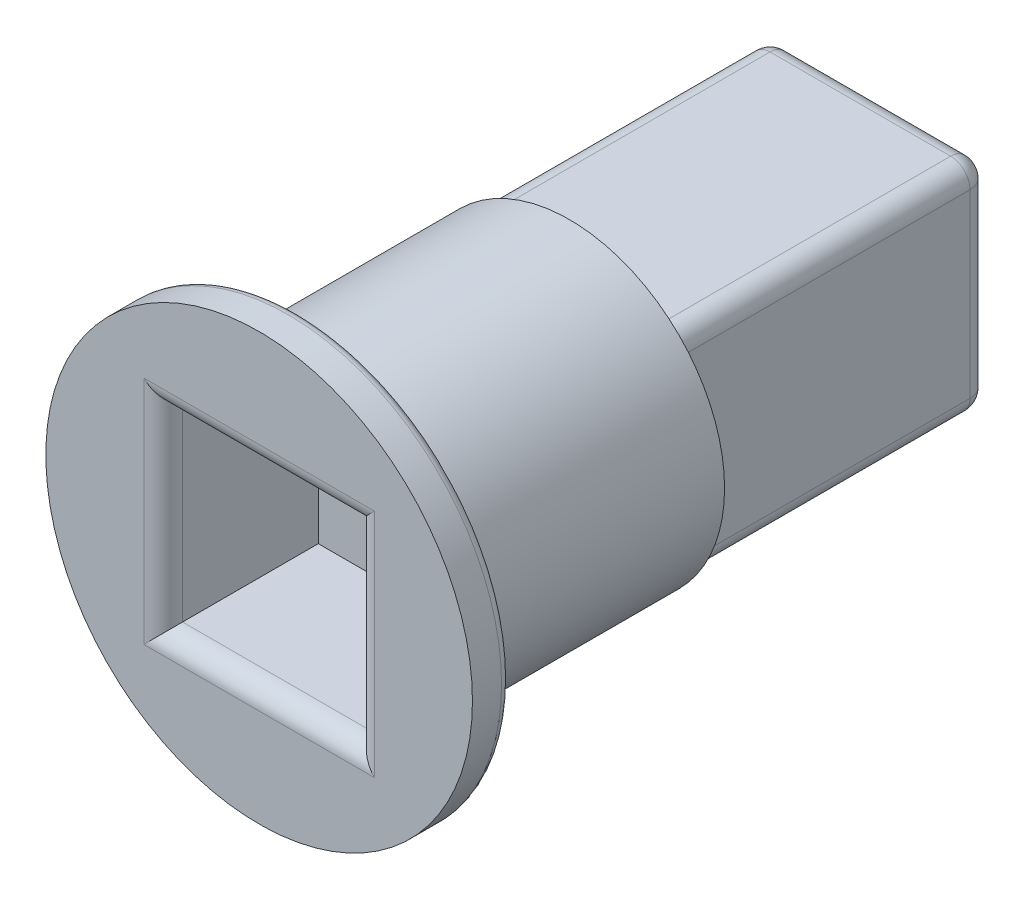
ISO-10303-21;
HEADER;
FILE_DESCRIPTION(('STEP AP214'),'2;1');
FILE_NAME('part.step','',(''),(''),'','','');
FILE_SCHEMA(('AUTOMOTIVE_DESIGN { 1 0 10303 214 1 1 1 1 }'));
ENDSEC;
DATA;
#1=APPLICATION_CONTEXT('core data for automotive mechanical design processes');
#2=APPLICATION_PROTOCOL_DEFINITION('international standard','automotive_design',2000,#1);
#3=PRODUCT_CONTEXT('',#1,'mechanical');
#4=PRODUCT('Part','Part','',(#3));
#5=PRODUCT_RELATED_PRODUCT_CATEGORY('part','',(#4));
#6=PRODUCT_DEFINITION_FORMATION('','',#4);
#7=PRODUCT_DEFINITION_CONTEXT('part definition',#1,'design');
#8=PRODUCT_DEFINITION('design','',#6,#7);
#9=PRODUCT_DEFINITION_SHAPE('','',#8);
#10=(LENGTH_UNIT() NAMED_UNIT(*) SI_UNIT(.MILLI.,.METRE.));
#11=(NAMED_UNIT(*) PLANE_ANGLE_UNIT() SI_UNIT($,.RADIAN.));
#12=(NAMED_UNIT(*) SI_UNIT($,.STERADIAN.) SOLID_ANGLE_UNIT());
#13=UNCERTAINTY_MEASURE_WITH_UNIT(LENGTH_MEASURE(1.E-05),#10,'distance_accuracy_value','');
#14=(GEOMETRIC_REPRESENTATION_CONTEXT(3) GLOBAL_UNCERTAINTY_ASSIGNED_CONTEXT((#13)) GLOBAL_UNIT_ASSIGNED_CONTEXT((#10,
#11,#12)) REPRESENTATION_CONTEXT('',''));
#15=CARTESIAN_POINT('',(0.,0.,0.));
#16=DIRECTION('',(0.,0.,1.));
#17=DIRECTION('',(1.,0.,0.));
#18=AXIS2_PLACEMENT_3D('',#15,#16,#17);
#19=CARTESIAN_POINT('',(0.,0.,-15.));
#20=DIRECTION('',(0.,0.,1.));
#21=DIRECTION('',(1.,0.,0.));
#22=AXIS2_PLACEMENT_3D('',#19,#20,#21);
#23=CYLINDRICAL_SURFACE('',#22,1.5);
#24=CARTESIAN_POINT('',(0.,0.,-15.));
#25=DIRECTION('',(0.,0.,1.));
#26=DIRECTION('',(1.,0.,0.));
#27=AXIS2_PLACEMENT_3D('',#24,#25,#26);
#28=CIRCLE('',#27,1.5);
#29=CARTESIAN_POINT('',(1.5,0.,-15.));
#30=VERTEX_POINT('',#29);
#31=EDGE_CURVE('E191',#30,#30,#28,.T.);
#32=ORIENTED_EDGE('',*,*,#31,.F.);
#33=EDGE_LOOP('',(#32));
#34=FACE_BOUND('',#33,.T.);
#35=CARTESIAN_POINT('',(0.,0.,-3.));
#36=DIRECTION('',(0.,0.,1.));
#37=DIRECTION('',(1.,0.,0.));
#38=AXIS2_PLACEMENT_3D('',#35,#36,#37);
#39=CIRCLE('',#38,1.5);
#40=CARTESIAN_POINT('',(1.5,0.,-3.));
#41=VERTEX_POINT('',#40);
#42=EDGE_CURVE('E187',#41,#41,#39,.F.);
#43=ORIENTED_EDGE('',*,*,#42,.F.);
#44=EDGE_LOOP('',(#43));
#45=FACE_BOUND('',#44,.T.);
#46=ADVANCED_FACE('F30',(#34,#45),#23,.F.);
#47=CARTESIAN_POINT('',(0.,0.,-7.));
#48=DIRECTION('',(0.,0.,1.));
#49=DIRECTION('',(1.,0.,0.));
#50=AXIS2_PLACEMENT_3D('',#47,#48,#49);
#51=PLANE('',#50);
#52=CARTESIAN_POINT('',(0.,0.,-7.));
#53=DIRECTION('',(0.,0.,1.));
#54=DIRECTION('',(1.,0.,0.));
#55=AXIS2_PLACEMENT_3D('',#52,#53,#54);
#56=CIRCLE('',#55,4.);
#57=CARTESIAN_POINT('',(2.82842712474619,2.82842712474619,-7.));
#58=VERTEX_POINT('',#57);
#59=CARTESIAN_POINT('',(-2.82842712474619,2.82842712474619,-7.));
#60=VERTEX_POINT('',#59);
#61=EDGE_CURVE('E208',#58,#60,#56,.T.);
#62=ORIENTED_EDGE('',*,*,#61,.F.);
#63=CARTESIAN_POINT('',(2.82842712474619,-2.82842712474619,-7.));
#64=VERTEX_POINT('',#63);
#65=EDGE_CURVE('E213',#64,#58,#56,.T.);
#66=ORIENTED_EDGE('',*,*,#65,.F.);
#67=CARTESIAN_POINT('',(-2.82842712474619,-2.82842712474619,-7.));
#68=VERTEX_POINT('',#67);
#69=EDGE_CURVE('E697',#68,#64,#56,.T.);
#70=ORIENTED_EDGE('',*,*,#69,.F.);
#71=EDGE_CURVE('E212',#60,#68,#56,.T.);
#72=ORIENTED_EDGE('',*,*,#71,.F.);
#73=EDGE_LOOP('',(#62,#66,#70,#72));
#74=FACE_BOUND('',#73,.T.);
#75=DIRECTION('',(1.,0.,0.));
#76=VECTOR('',#75,1.);
#77=CARTESIAN_POINT('',(2.82842712474619,2.82842712474619,-7.));
#78=LINE('',#77,#76);
#79=CARTESIAN_POINT('',(-2.32842712474619,2.82842712474619,-7.));
#80=VERTEX_POINT('',#79);
#81=CARTESIAN_POINT('',(2.32842712474619,2.82842712474619,-7.));
#82=VERTEX_POINT('',#81);
#83=EDGE_CURVE('E205',#80,#82,#78,.T.);
#84=ORIENTED_EDGE('',*,*,#83,.F.);
#85=CARTESIAN_POINT('',(-2.32842712474619,2.32842712474619,-7.));
#86=DIRECTION('',(0.,0.,1.));
#87=DIRECTION('',(1.,0.,0.));
#88=AXIS2_PLACEMENT_3D('',#85,#86,#87);
#89=CIRCLE('',#88,0.5);
#90=CARTESIAN_POINT('',(-2.82842712474619,2.32842712474619,-7.));
#91=VERTEX_POINT('',#90);
#92=EDGE_CURVE('E255',#80,#91,#89,.T.);
#93=ORIENTED_EDGE('',*,*,#92,.T.);
#94=DIRECTION('',(0.,1.,0.));
#95=VECTOR('',#94,1.);
#96=CARTESIAN_POINT('',(-2.82842712474619,2.82842712474619,-7.));
#97=LINE('',#96,#95);
#98=CARTESIAN_POINT('',(-2.82842712474619,-2.32842712474619,-7.));
#99=VERTEX_POINT('',#98);
#100=EDGE_CURVE('E203',#99,#91,#97,.T.);
#101=ORIENTED_EDGE('',*,*,#100,.F.);
#102=CARTESIAN_POINT('',(-2.32842712474619,-2.32842712474619,-7.));
#103=DIRECTION('',(0.,0.,1.));
#104=DIRECTION('',(1.,0.,0.));
#105=AXIS2_PLACEMENT_3D('',#102,#103,#104);
#106=CIRCLE('',#105,0.5);
#107=CARTESIAN_POINT('',(-2.32842712474619,-2.82842712474619,-7.));
#108=VERTEX_POINT('',#107);
#109=EDGE_CURVE('E249',#99,#108,#106,.T.);
#110=ORIENTED_EDGE('',*,*,#109,.T.);
#111=DIRECTION('',(-1.,0.,0.));
#112=VECTOR('',#111,1.);
#113=CARTESIAN_POINT('',(2.82842712474619,-2.82842712474619,-7.));
#114=LINE('',#113,#112);
#115=CARTESIAN_POINT('',(2.32842712474619,-2.82842712474619,-7.));
#116=VERTEX_POINT('',#115);
#117=EDGE_CURVE('E200',#116,#108,#114,.T.);
#118=ORIENTED_EDGE('',*,*,#117,.F.);
#119=CARTESIAN_POINT('',(2.32842712474619,-2.32842712474619,-7.));
#120=DIRECTION('',(0.,0.,1.));
#121=DIRECTION('',(1.,0.,0.));
#122=AXIS2_PLACEMENT_3D('',#119,#120,#121);
#123=CIRCLE('',#122,0.5);
#124=CARTESIAN_POINT('',(2.82842712474619,-2.32842712474619,-7.));
#125=VERTEX_POINT('',#124);
#126=EDGE_CURVE('E252',#116,#125,#123,.T.);
#127=ORIENTED_EDGE('',*,*,#126,.T.);
#128=DIRECTION('',(0.,-1.,0.));
#129=VECTOR('',#128,1.);
#130=CARTESIAN_POINT('',(2.82842712474619,2.82842712474619,-7.));
#131=LINE('',#130,#129);
#132=CARTESIAN_POINT('',(2.82842712474619,2.32842712474619,-7.));
#133=VERTEX_POINT('',#132);
#134=EDGE_CURVE('E198',#133,#125,#131,.T.);
#135=ORIENTED_EDGE('',*,*,#134,.F.);
#136=CARTESIAN_POINT('',(2.32842712474619,2.32842712474619,-7.));
#137=DIRECTION('',(0.,0.,1.));
#138=DIRECTION('',(1.,0.,0.));
#139=AXIS2_PLACEMENT_3D('',#136,#137,#138);
#140=CIRCLE('',#139,0.5);
#141=EDGE_CURVE('E258',#133,#82,#140,.T.);
#142=ORIENTED_EDGE('',*,*,#141,.T.);
#143=EDGE_LOOP('',(#84,#93,#101,#110,#118,#127,#135,#142));
#144=FACE_BOUND('',#143,.T.);
#145=ADVANCED_FACE('F344',(#74,#144),#51,.F.);
#146=CARTESIAN_POINT('',(0.,0.,-7.));
#147=DIRECTION('',(0.,0.,1.));
#148=DIRECTION('',(1.,0.,0.));
#149=AXIS2_PLACEMENT_3D('',#146,#147,#148);
#150=CYLINDRICAL_SURFACE('',#149,4.);
#151=ORIENTED_EDGE('',*,*,#61,.T.);
#152=ORIENTED_EDGE('',*,*,#71,.T.);
#153=ORIENTED_EDGE('',*,*,#69,.T.);
#154=ORIENTED_EDGE('',*,*,#65,.T.);
#155=EDGE_LOOP('',(#151,#152,#153,#154));
#156=FACE_BOUND('',#155,.T.);
#157=CARTESIAN_POINT('',(0.,0.,0.));
#158=DIRECTION('',(0.,0.,1.));
#159=DIRECTION('',(1.,0.,0.));
#160=AXIS2_PLACEMENT_3D('',#157,#158,#159);
#161=CIRCLE('',#160,4.);
#162=CARTESIAN_POINT('',(4.,0.,0.));
#163=VERTEX_POINT('',#162);
#164=EDGE_CURVE('E207',#163,#163,#161,.T.);
#165=ORIENTED_EDGE('',*,*,#164,.F.);
#166=EDGE_LOOP('',(#165));
#167=FACE_BOUND('',#166,.T.);
#168=ADVANCED_FACE('F350',(#156,#167),#150,.T.);
#169=CARTESIAN_POINT('',(2.82842712474619,2.82842712474619,-15.));
#170=DIRECTION('',(-1.,0.,0.));
#171=DIRECTION('',(0.,0.,1.));
#172=AXIS2_PLACEMENT_3D('',#169,#170,#171);
#173=PLANE('',#172);
#174=ORIENTED_EDGE('',*,*,#134,.T.);
#175=DIRECTION('',(0.,0.,1.));
#176=VECTOR('',#175,1.);
#177=CARTESIAN_POINT('',(2.82842712474619,-2.32842712474619,-15.));
#178=LINE('',#177,#176);
#179=CARTESIAN_POINT('',(2.82842712474619,-2.32842712474619,-14.5));
#180=VERTEX_POINT('',#179);
#181=EDGE_CURVE('E232',#125,#180,#178,.F.);
#182=ORIENTED_EDGE('',*,*,#181,.T.);
#183=DIRECTION('',(0.,-1.,0.));
#184=VECTOR('',#183,1.);
#185=CARTESIAN_POINT('',(2.82842712474619,2.82842712474619,-14.5));
#186=LINE('',#185,#184);
#187=CARTESIAN_POINT('',(2.82842712474619,2.32842712474619,-14.5));
#188=VERTEX_POINT('',#187);
#189=EDGE_CURVE('E228',#180,#188,#186,.F.);
#190=ORIENTED_EDGE('',*,*,#189,.T.);
#191=DIRECTION('',(0.,0.,1.));
#192=VECTOR('',#191,1.);
#193=CARTESIAN_POINT('',(2.82842712474619,2.32842712474619,-15.));
#194=LINE('',#193,#192);
#195=EDGE_CURVE('E230',#188,#133,#194,.T.);
#196=ORIENTED_EDGE('',*,*,#195,.T.);
#197=EDGE_LOOP('',(#174,#182,#190,#196));
#198=FACE_BOUND('',#197,.T.);
#199=ADVANCED_FACE('F386',(#198),#173,.F.);
#200=CARTESIAN_POINT('',(2.82842712474619,-2.82842712474619,-15.));
#201=DIRECTION('',(0.,1.,0.));
#202=DIRECTION('',(-1.,0.,0.));
#203=AXIS2_PLACEMENT_3D('',#200,#201,#202);
#204=PLANE('',#203);
#205=ORIENTED_EDGE('',*,*,#117,.T.);
#206=DIRECTION('',(0.,0.,1.));
#207=VECTOR('',#206,1.);
#208=CARTESIAN_POINT('',(-2.32842712474619,-2.82842712474619,-15.));
#209=LINE('',#208,#207);
#210=CARTESIAN_POINT('',(-2.32842712474619,-2.82842712474619,-14.5));
#211=VERTEX_POINT('',#210);
#212=EDGE_CURVE('E226',#108,#211,#209,.F.);
#213=ORIENTED_EDGE('',*,*,#212,.T.);
#214=DIRECTION('',(-1.,0.,0.));
#215=VECTOR('',#214,1.);
#216=CARTESIAN_POINT('',(2.82842712474619,-2.82842712474619,-14.5));
#217=LINE('',#216,#215);
#218=CARTESIAN_POINT('',(2.32842712474619,-2.82842712474619,-14.5));
#219=VERTEX_POINT('',#218);
#220=EDGE_CURVE('E222',#211,#219,#217,.F.);
#221=ORIENTED_EDGE('',*,*,#220,.T.);
#222=DIRECTION('',(0.,0.,1.));
#223=VECTOR('',#222,1.);
#224=CARTESIAN_POINT('',(2.32842712474619,-2.82842712474619,-15.));
#225=LINE('',#224,#223);
#226=EDGE_CURVE('E224',#219,#116,#225,.T.);
#227=ORIENTED_EDGE('',*,*,#226,.T.);
#228=EDGE_LOOP('',(#205,#213,#221,#227));
#229=FACE_BOUND('',#228,.T.);
#230=ADVANCED_FACE('F382',(#229),#204,.F.);
#231=CARTESIAN_POINT('',(-2.82842712474619,2.82842712474619,-15.));
#232=DIRECTION('',(1.,0.,0.));
#233=DIRECTION('',(0.,1.,0.));
#234=AXIS2_PLACEMENT_3D('',#231,#232,#233);
#235=PLANE('',#234);
#236=DIRECTION('',(0.,1.,0.));
#237=VECTOR('',#236,1.);
#238=CARTESIAN_POINT('',(-2.82842712474619,-2.82842712474619,-14.5));
#239=LINE('',#238,#237);
#240=CARTESIAN_POINT('',(-2.82842712474619,2.32842712474619,-14.5));
#241=VERTEX_POINT('',#240);
#242=CARTESIAN_POINT('',(-2.82842712474619,-2.32842712474619,-14.5));
#243=VERTEX_POINT('',#242);
#244=EDGE_CURVE('E211',#241,#243,#239,.F.);
#245=ORIENTED_EDGE('',*,*,#244,.T.);
#246=DIRECTION('',(0.,0.,1.));
#247=VECTOR('',#246,1.);
#248=CARTESIAN_POINT('',(-2.82842712474619,-2.32842712474619,-15.));
#249=LINE('',#248,#247);
#250=EDGE_CURVE('E219',#243,#99,#249,.T.);
#251=ORIENTED_EDGE('',*,*,#250,.T.);
#252=ORIENTED_EDGE('',*,*,#100,.T.);
#253=DIRECTION('',(0.,0.,1.));
#254=VECTOR('',#253,1.);
#255=CARTESIAN_POINT('',(-2.82842712474619,2.32842712474619,-15.));
#256=LINE('',#255,#254);
#257=EDGE_CURVE('E217',#91,#241,#256,.F.);
#258=ORIENTED_EDGE('',*,*,#257,.T.);
#259=EDGE_LOOP('',(#245,#251,#252,#258));
#260=FACE_BOUND('',#259,.T.);
#261=ADVANCED_FACE('F378',(#260),#235,.F.);
#262=CARTESIAN_POINT('',(2.82842712474619,2.82842712474619,-15.));
#263=DIRECTION('',(0.,-1.,0.));
#264=DIRECTION('',(1.,0.,0.));
#265=AXIS2_PLACEMENT_3D('',#262,#263,#264);
#266=PLANE('',#265);
#267=DIRECTION('',(1.,0.,0.));
#268=VECTOR('',#267,1.);
#269=CARTESIAN_POINT('',(-2.82842712474619,2.82842712474619,-14.5));
#270=LINE('',#269,#268);
#271=CARTESIAN_POINT('',(2.32842712474619,2.82842712474619,-14.5));
#272=VERTEX_POINT('',#271);
#273=CARTESIAN_POINT('',(-2.32842712474619,2.82842712474619,-14.5));
#274=VERTEX_POINT('',#273);
#275=EDGE_CURVE('E234',#272,#274,#270,.F.);
#276=ORIENTED_EDGE('',*,*,#275,.T.);
#277=DIRECTION('',(0.,0.,1.));
#278=VECTOR('',#277,1.);
#279=CARTESIAN_POINT('',(-2.32842712474619,2.82842712474619,-15.));
#280=LINE('',#279,#278);
#281=EDGE_CURVE('E238',#274,#80,#280,.T.);
#282=ORIENTED_EDGE('',*,*,#281,.T.);
#283=ORIENTED_EDGE('',*,*,#83,.T.);
#284=DIRECTION('',(0.,0.,1.));
#285=VECTOR('',#284,1.);
#286=CARTESIAN_POINT('',(2.32842712474619,2.82842712474619,-15.));
#287=LINE('',#286,#285);
#288=EDGE_CURVE('E236',#82,#272,#287,.F.);
#289=ORIENTED_EDGE('',*,*,#288,.T.);
#290=EDGE_LOOP('',(#276,#282,#283,#289));
#291=FACE_BOUND('',#290,.T.);
#292=ADVANCED_FACE('F374',(#291),#266,.F.);
#293=CARTESIAN_POINT('',(2.82842712474619,-2.82842712474619,-15.));
#294=DIRECTION('',(0.,0.,-1.));
#295=DIRECTION('',(-1.,0.,0.));
#296=AXIS2_PLACEMENT_3D('',#293,#294,#295);
#297=PLANE('',#296);
#298=ORIENTED_EDGE('',*,*,#31,.T.);
#299=EDGE_LOOP('',(#298));
#300=FACE_BOUND('',#299,.T.);
#301=DIRECTION('',(0.,-1.,0.));
#302=VECTOR('',#301,1.);
#303=CARTESIAN_POINT('',(2.32842712474619,-2.82842712474619,-15.));
#304=LINE('',#303,#302);
#305=CARTESIAN_POINT('',(2.32842712474619,2.32842712474619,-15.));
#306=VERTEX_POINT('',#305);
#307=CARTESIAN_POINT('',(2.32842712474619,-2.32842712474619,-15.));
#308=VERTEX_POINT('',#307);
#309=EDGE_CURVE('E240',#306,#308,#304,.T.);
#310=ORIENTED_EDGE('',*,*,#309,.T.);
#311=DIRECTION('',(-1.,0.,0.));
#312=VECTOR('',#311,1.);
#313=CARTESIAN_POINT('',(-2.82842712474619,-2.32842712474619,-15.));
#314=LINE('',#313,#312);
#315=CARTESIAN_POINT('',(-2.32842712474619,-2.32842712474619,-15.));
#316=VERTEX_POINT('',#315);
#317=EDGE_CURVE('E246',#308,#316,#314,.T.);
#318=ORIENTED_EDGE('',*,*,#317,.T.);
#319=DIRECTION('',(0.,1.,0.));
#320=VECTOR('',#319,1.);
#321=CARTESIAN_POINT('',(-2.32842712474619,2.82842712474619,-15.));
#322=LINE('',#321,#320);
#323=CARTESIAN_POINT('',(-2.32842712474619,2.32842712474619,-15.));
#324=VERTEX_POINT('',#323);
#325=EDGE_CURVE('E244',#316,#324,#322,.T.);
#326=ORIENTED_EDGE('',*,*,#325,.T.);
#327=DIRECTION('',(1.,0.,0.));
#328=VECTOR('',#327,1.);
#329=CARTESIAN_POINT('',(2.82842712474619,2.32842712474619,-15.));
#330=LINE('',#329,#328);
#331=EDGE_CURVE('E242',#324,#306,#330,.T.);
#332=ORIENTED_EDGE('',*,*,#331,.T.);
#333=EDGE_LOOP('',(#310,#318,#326,#332));
#334=FACE_BOUND('',#333,.T.);
#335=ADVANCED_FACE('F370',(#300,#334),#297,.T.);
#336=CARTESIAN_POINT('',(2.32842712474619,2.32842712474619,-15.));
#337=DIRECTION('',(0.,0.,1.));
#338=DIRECTION('',(1.,0.,0.));
#339=AXIS2_PLACEMENT_3D('',#336,#337,#338);
#340=CYLINDRICAL_SURFACE('',#339,0.5);
#341=CARTESIAN_POINT('',(2.32842712474619,2.32842712474619,-14.5));
#342=DIRECTION('',(0.,0.,-1.));
#343=DIRECTION('',(-1.,0.,0.));
#344=AXIS2_PLACEMENT_3D('',#341,#342,#343);
#345=CIRCLE('',#344,0.5);
#346=EDGE_CURVE('E201',#272,#188,#345,.T.);
#347=ORIENTED_EDGE('',*,*,#346,.F.);
#348=ORIENTED_EDGE('',*,*,#288,.F.);
#349=ORIENTED_EDGE('',*,*,#141,.F.);
#350=ORIENTED_EDGE('',*,*,#195,.F.);
#351=EDGE_LOOP('',(#347,#348,#349,#350));
#352=FACE_BOUND('',#351,.T.);
#353=ADVANCED_FACE('F373',(#352),#340,.T.);
#354=CARTESIAN_POINT('',(2.32842712474619,2.32842712474619,-14.5));
#355=DIRECTION('',(0.,0.,1.));
#356=DIRECTION('',(1.,0.,0.));
#357=AXIS2_PLACEMENT_3D('',#354,#355,#356);
#358=SPHERICAL_SURFACE('',#357,0.5);
#359=CARTESIAN_POINT('',(2.32842712474619,2.32842712474619,-14.5));
#360=DIRECTION('',(1.,0.,0.));
#361=DIRECTION('',(0.,0.,-1.));
#362=AXIS2_PLACEMENT_3D('',#359,#360,#361);
#363=CIRCLE('',#362,0.5);
#364=EDGE_CURVE('E287',#272,#306,#363,.F.);
#365=ORIENTED_EDGE('',*,*,#364,.F.);
#366=ORIENTED_EDGE('',*,*,#346,.T.);
#367=CARTESIAN_POINT('',(2.32842712474619,2.32842712474619,-14.5));
#368=DIRECTION('',(0.,1.,0.));
#369=DIRECTION('',(0.,0.,1.));
#370=AXIS2_PLACEMENT_3D('',#367,#368,#369);
#371=CIRCLE('',#370,0.5);
#372=EDGE_CURVE('E290',#306,#188,#371,.F.);
#373=ORIENTED_EDGE('',*,*,#372,.F.);
#374=EDGE_LOOP('',(#365,#366,#373));
#375=FACE_BOUND('',#374,.T.);
#376=ADVANCED_FACE('F432',(#375),#358,.T.);
#377=CARTESIAN_POINT('',(2.32842712474619,-2.32842712474619,-15.));
#378=DIRECTION('',(0.,0.,1.));
#379=DIRECTION('',(1.,0.,0.));
#380=AXIS2_PLACEMENT_3D('',#377,#378,#379);
#381=CYLINDRICAL_SURFACE('',#380,0.5);
#382=ORIENTED_EDGE('',*,*,#126,.F.);
#383=ORIENTED_EDGE('',*,*,#226,.F.);
#384=CARTESIAN_POINT('',(2.32842712474619,-2.32842712474619,-14.5));
#385=DIRECTION('',(0.,0.,-1.));
#386=DIRECTION('',(-1.,0.,0.));
#387=AXIS2_PLACEMENT_3D('',#384,#385,#386);
#388=CIRCLE('',#387,0.5);
#389=EDGE_CURVE('E284',#180,#219,#388,.T.);
#390=ORIENTED_EDGE('',*,*,#389,.F.);
#391=ORIENTED_EDGE('',*,*,#181,.F.);
#392=EDGE_LOOP('',(#382,#383,#390,#391));
#393=FACE_BOUND('',#392,.T.);
#394=ADVANCED_FACE('F428',(#393),#381,.T.);
#395=CARTESIAN_POINT('',(2.32842712474619,-2.82842712474619,-14.5));
#396=DIRECTION('',(0.,1.,0.));
#397=DIRECTION('',(0.,0.,1.));
#398=AXIS2_PLACEMENT_3D('',#395,#396,#397);
#399=CYLINDRICAL_SURFACE('',#398,0.5);
#400=ORIENTED_EDGE('',*,*,#372,.T.);
#401=ORIENTED_EDGE('',*,*,#189,.F.);
#402=CARTESIAN_POINT('',(2.32842712474619,-2.32842712474619,-14.5));
#403=DIRECTION('',(0.,-1.,0.));
#404=DIRECTION('',(0.,0.,-1.));
#405=AXIS2_PLACEMENT_3D('',#402,#403,#404);
#406=CIRCLE('',#405,0.5);
#407=EDGE_CURVE('E281',#308,#180,#406,.T.);
#408=ORIENTED_EDGE('',*,*,#407,.F.);
#409=ORIENTED_EDGE('',*,*,#309,.F.);
#410=EDGE_LOOP('',(#400,#401,#408,#409));
#411=FACE_BOUND('',#410,.T.);
#412=ADVANCED_FACE('F424',(#411),#399,.T.);
#413=CARTESIAN_POINT('',(2.82842712474619,2.32842712474619,-14.5));
#414=DIRECTION('',(-1.,0.,0.));
#415=DIRECTION('',(0.,-1.,0.));
#416=AXIS2_PLACEMENT_3D('',#413,#414,#415);
#417=CYLINDRICAL_SURFACE('',#416,0.5);
#418=ORIENTED_EDGE('',*,*,#364,.T.);
#419=ORIENTED_EDGE('',*,*,#331,.F.);
#420=CARTESIAN_POINT('',(-2.32842712474619,2.32842712474619,-14.5));
#421=DIRECTION('',(-1.,0.,0.));
#422=DIRECTION('',(0.,0.,1.));
#423=AXIS2_PLACEMENT_3D('',#420,#421,#422);
#424=CIRCLE('',#423,0.5);
#425=EDGE_CURVE('E278',#274,#324,#424,.T.);
#426=ORIENTED_EDGE('',*,*,#425,.F.);
#427=ORIENTED_EDGE('',*,*,#275,.F.);
#428=EDGE_LOOP('',(#418,#419,#426,#427));
#429=FACE_BOUND('',#428,.T.);
#430=ADVANCED_FACE('F420',(#429),#417,.T.);
#431=CARTESIAN_POINT('',(-2.32842712474619,2.32842712474619,-15.));
#432=DIRECTION('',(0.,0.,1.));
#433=DIRECTION('',(1.,0.,0.));
#434=AXIS2_PLACEMENT_3D('',#431,#432,#433);
#435=CYLINDRICAL_SURFACE('',#434,0.5);
#436=ORIENTED_EDGE('',*,*,#92,.F.);
#437=ORIENTED_EDGE('',*,*,#281,.F.);
#438=CARTESIAN_POINT('',(-2.32842712474619,2.32842712474619,-14.5));
#439=DIRECTION('',(0.,0.,-1.));
#440=DIRECTION('',(-1.,0.,0.));
#441=AXIS2_PLACEMENT_3D('',#438,#439,#440);
#442=CIRCLE('',#441,0.5);
#443=EDGE_CURVE('E275',#241,#274,#442,.T.);
#444=ORIENTED_EDGE('',*,*,#443,.F.);
#445=ORIENTED_EDGE('',*,*,#257,.F.);
#446=EDGE_LOOP('',(#436,#437,#444,#445));
#447=FACE_BOUND('',#446,.T.);
#448=ADVANCED_FACE('F416',(#447),#435,.T.);
#449=CARTESIAN_POINT('',(2.32842712474619,-2.32842712474619,-14.5));
#450=DIRECTION('',(0.,0.,1.));
#451=DIRECTION('',(1.,0.,0.));
#452=AXIS2_PLACEMENT_3D('',#449,#450,#451);
#453=SPHERICAL_SURFACE('',#452,0.5);
#454=ORIENTED_EDGE('',*,*,#407,.T.);
#455=ORIENTED_EDGE('',*,*,#389,.T.);
#456=CARTESIAN_POINT('',(2.32842712474619,-2.32842712474619,-14.5));
#457=DIRECTION('',(1.,0.,0.));
#458=DIRECTION('',(0.,0.,-1.));
#459=AXIS2_PLACEMENT_3D('',#456,#457,#458);
#460=CIRCLE('',#459,0.5);
#461=EDGE_CURVE('E272',#308,#219,#460,.F.);
#462=ORIENTED_EDGE('',*,*,#461,.F.);
#463=EDGE_LOOP('',(#454,#455,#462));
#464=FACE_BOUND('',#463,.T.);
#465=ADVANCED_FACE('F412',(#464),#453,.T.);
#466=CARTESIAN_POINT('',(-2.32842712474619,2.32842712474619,-14.5));
#467=DIRECTION('',(0.,0.,1.));
#468=DIRECTION('',(1.,0.,0.));
#469=AXIS2_PLACEMENT_3D('',#466,#467,#468);
#470=SPHERICAL_SURFACE('',#469,0.5);
#471=ORIENTED_EDGE('',*,*,#443,.T.);
#472=ORIENTED_EDGE('',*,*,#425,.T.);
#473=CARTESIAN_POINT('',(-2.32842712474619,2.32842712474619,-14.5));
#474=DIRECTION('',(0.,1.,0.));
#475=DIRECTION('',(0.,0.,1.));
#476=AXIS2_PLACEMENT_3D('',#473,#474,#475);
#477=CIRCLE('',#476,0.5);
#478=EDGE_CURVE('E269',#241,#324,#477,.F.);
#479=ORIENTED_EDGE('',*,*,#478,.F.);
#480=EDGE_LOOP('',(#471,#472,#479));
#481=FACE_BOUND('',#480,.T.);
#482=ADVANCED_FACE('F408',(#481),#470,.T.);
#483=CARTESIAN_POINT('',(2.82842712474619,-2.32842712474619,-14.5));
#484=DIRECTION('',(1.,0.,0.));
#485=DIRECTION('',(0.,1.,0.));
#486=AXIS2_PLACEMENT_3D('',#483,#484,#485);
#487=CYLINDRICAL_SURFACE('',#486,0.5);
#488=ORIENTED_EDGE('',*,*,#461,.T.);
#489=ORIENTED_EDGE('',*,*,#220,.F.);
#490=CARTESIAN_POINT('',(-2.32842712474619,-2.32842712474619,-14.5));
#491=DIRECTION('',(-1.,0.,0.));
#492=DIRECTION('',(0.,-1.,0.));
#493=AXIS2_PLACEMENT_3D('',#490,#491,#492);
#494=CIRCLE('',#493,0.5);
#495=EDGE_CURVE('E266',#316,#211,#494,.T.);
#496=ORIENTED_EDGE('',*,*,#495,.F.);
#497=ORIENTED_EDGE('',*,*,#317,.F.);
#498=EDGE_LOOP('',(#488,#489,#496,#497));
#499=FACE_BOUND('',#498,.T.);
#500=ADVANCED_FACE('F404',(#499),#487,.T.);
#501=CARTESIAN_POINT('',(-2.32842712474619,-2.82842712474619,-14.5));
#502=DIRECTION('',(0.,-1.,0.));
#503=DIRECTION('',(1.,0.,0.));
#504=AXIS2_PLACEMENT_3D('',#501,#502,#503);
#505=CYLINDRICAL_SURFACE('',#504,0.5);
#506=ORIENTED_EDGE('',*,*,#478,.T.);
#507=ORIENTED_EDGE('',*,*,#325,.F.);
#508=CARTESIAN_POINT('',(-2.32842712474619,-2.32842712474619,-14.5));
#509=DIRECTION('',(0.,-1.,0.));
#510=DIRECTION('',(0.,0.,-1.));
#511=AXIS2_PLACEMENT_3D('',#508,#509,#510);
#512=CIRCLE('',#511,0.5);
#513=EDGE_CURVE('E264',#243,#316,#512,.T.);
#514=ORIENTED_EDGE('',*,*,#513,.F.);
#515=ORIENTED_EDGE('',*,*,#244,.F.);
#516=EDGE_LOOP('',(#506,#507,#514,#515));
#517=FACE_BOUND('',#516,.T.);
#518=ADVANCED_FACE('F400',(#517),#505,.T.);
#519=CARTESIAN_POINT('',(-2.32842712474619,-2.32842712474619,-14.5));
#520=DIRECTION('',(0.,0.,1.));
#521=DIRECTION('',(1.,0.,0.));
#522=AXIS2_PLACEMENT_3D('',#519,#520,#521);
#523=SPHERICAL_SURFACE('',#522,0.5);
#524=ORIENTED_EDGE('',*,*,#513,.T.);
#525=ORIENTED_EDGE('',*,*,#495,.T.);
#526=CARTESIAN_POINT('',(-2.32842712474619,-2.32842712474619,-14.5));
#527=DIRECTION('',(0.,0.,-1.));
#528=DIRECTION('',(-1.,0.,0.));
#529=AXIS2_PLACEMENT_3D('',#526,#527,#528);
#530=CIRCLE('',#529,0.5);
#531=EDGE_CURVE('E197',#243,#211,#530,.F.);
#532=ORIENTED_EDGE('',*,*,#531,.F.);
#533=EDGE_LOOP('',(#524,#525,#532));
#534=FACE_BOUND('',#533,.T.);
#535=ADVANCED_FACE('F396',(#534),#523,.T.);
#536=CARTESIAN_POINT('',(-2.32842712474619,-2.32842712474619,-15.));
#537=DIRECTION('',(0.,0.,1.));
#538=DIRECTION('',(1.,0.,0.));
#539=AXIS2_PLACEMENT_3D('',#536,#537,#538);
#540=CYLINDRICAL_SURFACE('',#539,0.5);
#541=ORIENTED_EDGE('',*,*,#531,.T.);
#542=ORIENTED_EDGE('',*,*,#212,.F.);
#543=ORIENTED_EDGE('',*,*,#109,.F.);
#544=ORIENTED_EDGE('',*,*,#250,.F.);
#545=EDGE_LOOP('',(#541,#542,#543,#544));
#546=FACE_BOUND('',#545,.T.);
#547=ADVANCED_FACE('F368',(#546),#540,.T.);
#548=CARTESIAN_POINT('',(0.,0.,1.));
#549=DIRECTION('',(0.,0.,-1.));
#550=DIRECTION('',(-1.,0.,0.));
#551=AXIS2_PLACEMENT_3D('',#548,#549,#550);
#552=CYLINDRICAL_SURFACE('',#551,5.5);
#553=CARTESIAN_POINT('',(0.,0.,0.25));
#554=DIRECTION('',(0.,0.,1.));
#555=DIRECTION('',(1.,0.,0.));
#556=AXIS2_PLACEMENT_3D('',#553,#554,#555);
#557=CIRCLE('',#556,5.5);
#558=CARTESIAN_POINT('',(5.5,0.,0.25));
#559=VERTEX_POINT('',#558);
#560=EDGE_CURVE('E261',#559,#559,#557,.T.);
#561=ORIENTED_EDGE('',*,*,#560,.T.);
#562=EDGE_LOOP('',(#561));
#563=FACE_BOUND('',#562,.T.);
#564=CARTESIAN_POINT('',(0.,0.,1.));
#565=DIRECTION('',(0.,0.,1.));
#566=DIRECTION('',(1.,0.,0.));
#567=AXIS2_PLACEMENT_3D('',#564,#565,#566);
#568=CIRCLE('',#567,5.5);
#569=CARTESIAN_POINT('',(5.5,0.,1.));
#570=VERTEX_POINT('',#569);
#571=EDGE_CURVE('E194',#570,#570,#568,.T.);
#572=ORIENTED_EDGE('',*,*,#571,.F.);
#573=EDGE_LOOP('',(#572));
#574=FACE_BOUND('',#573,.T.);
#575=ADVANCED_FACE('F361',(#563,#574),#552,.T.);
#576=CARTESIAN_POINT('',(0.,0.,1.));
#577=DIRECTION('',(0.,0.,1.));
#578=DIRECTION('',(1.,0.,0.));
#579=AXIS2_PLACEMENT_3D('',#576,#577,#578);
#580=PLANE('',#579);
#581=DIRECTION('',(1.,0.,0.));
#582=VECTOR('',#581,1.);
#583=CARTESIAN_POINT('',(-2.47487373415292,-2.97487373415292,1.));
#584=LINE('',#583,#582);
#585=CARTESIAN_POINT('',(2.97487373415292,-2.97487373415292,1.));
#586=VERTEX_POINT('',#585);
#587=CARTESIAN_POINT('',(-2.97487373415292,-2.97487373415292,1.));
#588=VERTEX_POINT('',#587);
#589=EDGE_CURVE('E307',#586,#588,#584,.F.);
#590=ORIENTED_EDGE('',*,*,#589,.T.);
#591=DIRECTION('',(0.,-1.,0.));
#592=VECTOR('',#591,1.);
#593=CARTESIAN_POINT('',(-2.97487373415292,2.47487373415292,1.));
#594=LINE('',#593,#592);
#595=CARTESIAN_POINT('',(-2.97487373415292,2.97487373415292,1.));
#596=VERTEX_POINT('',#595);
#597=EDGE_CURVE('E309',#588,#596,#594,.F.);
#598=ORIENTED_EDGE('',*,*,#597,.T.);
#599=DIRECTION('',(-1.,0.,0.));
#600=VECTOR('',#599,1.);
#601=CARTESIAN_POINT('',(2.47487373415292,2.97487373415292,1.));
#602=LINE('',#601,#600);
#603=CARTESIAN_POINT('',(2.97487373415292,2.97487373415292,1.));
#604=VERTEX_POINT('',#603);
#605=EDGE_CURVE('E303',#596,#604,#602,.F.);
#606=ORIENTED_EDGE('',*,*,#605,.T.);
#607=DIRECTION('',(0.,1.,0.));
#608=VECTOR('',#607,1.);
#609=CARTESIAN_POINT('',(2.97487373415292,-2.47487373415292,1.));
#610=LINE('',#609,#608);
#611=EDGE_CURVE('E305',#604,#586,#610,.F.);
#612=ORIENTED_EDGE('',*,*,#611,.T.);
#613=EDGE_LOOP('',(#590,#598,#606,#612));
#614=FACE_BOUND('',#613,.T.);
#615=ORIENTED_EDGE('',*,*,#571,.T.);
#616=EDGE_LOOP('',(#615));
#617=FACE_BOUND('',#616,.T.);
#618=ADVANCED_FACE('F357',(#614,#617),#580,.T.);
#619=CARTESIAN_POINT('',(0.,0.,0.));
#620=DIRECTION('',(0.,0.,1.));
#621=DIRECTION('',(1.,0.,0.));
#622=AXIS2_PLACEMENT_3D('',#619,#620,#621);
#623=PLANE('',#622);
#624=CARTESIAN_POINT('',(0.,0.,0.));
#625=DIRECTION('',(0.,0.,1.));
#626=DIRECTION('',(1.,0.,0.));
#627=AXIS2_PLACEMENT_3D('',#624,#625,#626);
#628=CIRCLE('',#627,5.25);
#629=CARTESIAN_POINT('',(5.25,0.,0.));
#630=VERTEX_POINT('',#629);
#631=EDGE_CURVE('E299',#630,#630,#628,.F.);
#632=ORIENTED_EDGE('',*,*,#631,.T.);
#633=EDGE_LOOP('',(#632));
#634=FACE_BOUND('',#633,.T.);
#635=ORIENTED_EDGE('',*,*,#164,.T.);
#636=EDGE_LOOP('',(#635));
#637=FACE_BOUND('',#636,.T.);
#638=ADVANCED_FACE('F360',(#634,#637),#623,.F.);
#639=CARTESIAN_POINT('',(-2.47487373415292,-2.47487373415292,-3.));
#640=DIRECTION('',(0.,0.,1.));
#641=DIRECTION('',(1.,0.,0.));
#642=AXIS2_PLACEMENT_3D('',#639,#640,#641);
#643=PLANE('',#642);
#644=DIRECTION('',(0.,-1.,0.));
#645=VECTOR('',#644,1.);
#646=CARTESIAN_POINT('',(-2.47487373415292,2.47487373415292,-3.));
#647=LINE('',#646,#645);
#648=CARTESIAN_POINT('',(-2.47487373415292,2.47487373415292,-3.));
#649=VERTEX_POINT('',#648);
#650=CARTESIAN_POINT('',(-2.47487373415292,-2.47487373415292,-3.));
#651=VERTEX_POINT('',#650);
#652=EDGE_CURVE('E161',#649,#651,#647,.T.);
#653=ORIENTED_EDGE('',*,*,#652,.T.);
#654=DIRECTION('',(1.,0.,0.));
#655=VECTOR('',#654,1.);
#656=CARTESIAN_POINT('',(-2.47487373415292,-2.47487373415292,-3.));
#657=LINE('',#656,#655);
#658=CARTESIAN_POINT('',(2.47487373415292,-2.47487373415292,-3.));
#659=VERTEX_POINT('',#658);
#660=EDGE_CURVE('E169',#651,#659,#657,.T.);
#661=ORIENTED_EDGE('',*,*,#660,.T.);
#662=DIRECTION('',(0.,1.,0.));
#663=VECTOR('',#662,1.);
#664=CARTESIAN_POINT('',(2.47487373415292,2.47487373415292,-3.));
#665=LINE('',#664,#663);
#666=CARTESIAN_POINT('',(2.47487373415292,2.47487373415292,-3.));
#667=VERTEX_POINT('',#666);
#668=EDGE_CURVE('E174',#659,#667,#665,.T.);
#669=ORIENTED_EDGE('',*,*,#668,.T.);
#670=DIRECTION('',(-1.,0.,0.));
#671=VECTOR('',#670,1.);
#672=CARTESIAN_POINT('',(-2.47487373415292,2.47487373415292,-3.));
#673=LINE('',#672,#671);
#674=EDGE_CURVE('E166',#667,#649,#673,.T.);
#675=ORIENTED_EDGE('',*,*,#674,.T.);
#676=EDGE_LOOP('',(#653,#661,#669,#675));
#677=FACE_BOUND('',#676,.T.);
#678=ORIENTED_EDGE('',*,*,#42,.T.);
#679=EDGE_LOOP('',(#678));
#680=FACE_BOUND('',#679,.T.);
#681=ADVANCED_FACE('F176',(#677,#680),#643,.T.);
#682=CARTESIAN_POINT('',(-2.47487373415292,2.47487373415292,-3.));
#683=DIRECTION('',(-1.,0.,0.));
#684=DIRECTION('',(0.,-1.,0.));
#685=AXIS2_PLACEMENT_3D('',#682,#683,#684);
#686=PLANE('',#685);
#687=DIRECTION('',(0.,0.,1.));
#688=VECTOR('',#687,1.);
#689=CARTESIAN_POINT('',(-2.47487373415292,2.47487373415292,-3.));
#690=LINE('',#689,#688);
#691=CARTESIAN_POINT('',(-2.47487373415292,2.47487373415292,0.5));
#692=VERTEX_POINT('',#691);
#693=EDGE_CURVE('E185',#649,#692,#690,.T.);
#694=ORIENTED_EDGE('',*,*,#693,.T.);
#695=DIRECTION('',(0.,-1.,0.));
#696=VECTOR('',#695,1.);
#697=CARTESIAN_POINT('',(-2.47487373415292,-2.47487373415292,0.5));
#698=LINE('',#697,#696);
#699=CARTESIAN_POINT('',(-2.47487373415292,-2.47487373415292,0.5));
#700=VERTEX_POINT('',#699);
#701=EDGE_CURVE('E164',#692,#700,#698,.T.);
#702=ORIENTED_EDGE('',*,*,#701,.T.);
#703=DIRECTION('',(0.,0.,1.));
#704=VECTOR('',#703,1.);
#705=CARTESIAN_POINT('',(-2.47487373415292,-2.47487373415292,-3.));
#706=LINE('',#705,#704);
#707=EDGE_CURVE('E156',#651,#700,#706,.T.);
#708=ORIENTED_EDGE('',*,*,#707,.F.);
#709=ORIENTED_EDGE('',*,*,#652,.F.);
#710=EDGE_LOOP('',(#694,#702,#708,#709));
#711=FACE_BOUND('',#710,.T.);
#712=ADVANCED_FACE('F159',(#711),#686,.F.);
#713=CARTESIAN_POINT('',(-2.47487373415292,2.47487373415292,-3.));
#714=DIRECTION('',(0.,1.,0.));
#715=DIRECTION('',(0.,0.,1.));
#716=AXIS2_PLACEMENT_3D('',#713,#714,#715);
#717=PLANE('',#716);
#718=DIRECTION('',(0.,0.,1.));
#719=VECTOR('',#718,1.);
#720=CARTESIAN_POINT('',(2.47487373415292,2.47487373415292,-3.));
#721=LINE('',#720,#719);
#722=CARTESIAN_POINT('',(2.47487373415292,2.47487373415292,0.5));
#723=VERTEX_POINT('',#722);
#724=EDGE_CURVE('E188',#667,#723,#721,.T.);
#725=ORIENTED_EDGE('',*,*,#724,.T.);
#726=DIRECTION('',(-1.,0.,0.));
#727=VECTOR('',#726,1.);
#728=CARTESIAN_POINT('',(-2.47487373415292,2.47487373415292,0.5));
#729=LINE('',#728,#727);
#730=EDGE_CURVE('E11',#723,#692,#729,.T.);
#731=ORIENTED_EDGE('',*,*,#730,.T.);
#732=ORIENTED_EDGE('',*,*,#693,.F.);
#733=ORIENTED_EDGE('',*,*,#674,.F.);
#734=EDGE_LOOP('',(#725,#731,#732,#733));
#735=FACE_BOUND('',#734,.T.);
#736=ADVANCED_FACE('F332',(#735),#717,.F.);
#737=CARTESIAN_POINT('',(2.47487373415292,2.47487373415292,-3.));
#738=DIRECTION('',(1.,0.,0.));
#739=DIRECTION('',(0.,0.,-1.));
#740=AXIS2_PLACEMENT_3D('',#737,#738,#739);
#741=PLANE('',#740);
#742=DIRECTION('',(0.,0.,1.));
#743=VECTOR('',#742,1.);
#744=CARTESIAN_POINT('',(2.47487373415292,-2.47487373415292,-3.));
#745=LINE('',#744,#743);
#746=CARTESIAN_POINT('',(2.47487373415292,-2.47487373415292,0.5));
#747=VERTEX_POINT('',#746);
#748=EDGE_CURVE('E165',#659,#747,#745,.T.);
#749=ORIENTED_EDGE('',*,*,#748,.T.);
#750=DIRECTION('',(0.,1.,0.));
#751=VECTOR('',#750,1.);
#752=CARTESIAN_POINT('',(2.47487373415292,2.47487373415292,0.5));
#753=LINE('',#752,#751);
#754=EDGE_CURVE('E39',#747,#723,#753,.T.);
#755=ORIENTED_EDGE('',*,*,#754,.T.);
#756=ORIENTED_EDGE('',*,*,#724,.F.);
#757=ORIENTED_EDGE('',*,*,#668,.F.);
#758=EDGE_LOOP('',(#749,#755,#756,#757));
#759=FACE_BOUND('',#758,.T.);
#760=ADVANCED_FACE('F333',(#759),#741,.F.);
#761=CARTESIAN_POINT('',(-2.47487373415292,-2.47487373415292,-3.));
#762=DIRECTION('',(0.,-1.,0.));
#763=DIRECTION('',(0.,0.,-1.));
#764=AXIS2_PLACEMENT_3D('',#761,#762,#763);
#765=PLANE('',#764);
#766=ORIENTED_EDGE('',*,*,#707,.T.);
#767=DIRECTION('',(1.,0.,0.));
#768=VECTOR('',#767,1.);
#769=CARTESIAN_POINT('',(2.47487373415292,-2.47487373415292,0.5));
#770=LINE('',#769,#768);
#771=EDGE_CURVE('E54',#700,#747,#770,.T.);
#772=ORIENTED_EDGE('',*,*,#771,.T.);
#773=ORIENTED_EDGE('',*,*,#748,.F.);
#774=ORIENTED_EDGE('',*,*,#660,.F.);
#775=EDGE_LOOP('',(#766,#772,#773,#774));
#776=FACE_BOUND('',#775,.T.);
#777=ADVANCED_FACE('F170',(#776),#765,.F.);
#778=CARTESIAN_POINT('',(0.,0.,0.25));
#779=DIRECTION('',(0.,0.,1.));
#780=DIRECTION('',(1.,0.,0.));
#781=AXIS2_PLACEMENT_3D('',#778,#779,#780);
#782=TOROIDAL_SURFACE('',#781,5.25,0.25);
#783=ORIENTED_EDGE('',*,*,#631,.F.);
#784=EDGE_LOOP('',(#783));
#785=FACE_BOUND('',#784,.T.);
#786=ORIENTED_EDGE('',*,*,#560,.F.);
#787=EDGE_LOOP('',(#786));
#788=FACE_BOUND('',#787,.T.);
#789=ADVANCED_FACE('F340',(#785,#788),#782,.T.);
#790=CARTESIAN_POINT('',(2.97487373415292,2.47487373415292,0.5));
#791=DIRECTION('',(0.,-1.,0.));
#792=DIRECTION('',(0.,0.,-1.));
#793=AXIS2_PLACEMENT_3D('',#790,#791,#792);
#794=CYLINDRICAL_SURFACE('',#793,0.5);
#795=CARTESIAN_POINT('',(2.97487373415292,-2.97487373415292,0.5));
#796=DIRECTION('',(-0.707106781186547,-0.707106781186547,0.));
#797=DIRECTION('',(-0.707106781186547,0.707106781186547,0.));
#798=AXIS2_PLACEMENT_3D('',#795,#796,#797);
#799=ELLIPSE('',#798,0.707106781186547,0.5);
#800=EDGE_CURVE('E181',#586,#747,#799,.T.);
#801=ORIENTED_EDGE('',*,*,#800,.F.);
#802=ORIENTED_EDGE('',*,*,#611,.F.);
#803=CARTESIAN_POINT('',(2.97487373415292,2.97487373415292,0.5));
#804=DIRECTION('',(0.707106781186547,-0.707106781186547,0.));
#805=DIRECTION('',(-0.707106781186547,-0.707106781186547,0.));
#806=AXIS2_PLACEMENT_3D('',#803,#804,#805);
#807=ELLIPSE('',#806,0.707106781186547,0.5);
#808=EDGE_CURVE('E34',#723,#604,#807,.F.);
#809=ORIENTED_EDGE('',*,*,#808,.F.);
#810=ORIENTED_EDGE('',*,*,#754,.F.);
#811=EDGE_LOOP('',(#801,#802,#809,#810));
#812=FACE_BOUND('',#811,.T.);
#813=ADVANCED_FACE('F32',(#812),#794,.T.);
#814=CARTESIAN_POINT('',(-2.47487373415292,2.97487373415292,0.5));
#815=DIRECTION('',(1.,0.,0.));
#816=DIRECTION('',(0.,0.,-1.));
#817=AXIS2_PLACEMENT_3D('',#814,#815,#816);
#818=CYLINDRICAL_SURFACE('',#817,0.5);
#819=ORIENTED_EDGE('',*,*,#808,.T.);
#820=ORIENTED_EDGE('',*,*,#605,.F.);
#821=CARTESIAN_POINT('',(-2.97487373415292,2.97487373415292,0.5));
#822=DIRECTION('',(0.707106781186547,0.707106781186548,0.));
#823=DIRECTION('',(-0.707106781186547,0.707106781186547,0.));
#824=AXIS2_PLACEMENT_3D('',#821,#822,#823);
#825=ELLIPSE('',#824,0.707106781186548,0.5);
#826=EDGE_CURVE('E316',#692,#596,#825,.F.);
#827=ORIENTED_EDGE('',*,*,#826,.F.);
#828=ORIENTED_EDGE('',*,*,#730,.F.);
#829=EDGE_LOOP('',(#819,#820,#827,#828));
#830=FACE_BOUND('',#829,.T.);
#831=ADVANCED_FACE('F330',(#830),#818,.T.);
#832=CARTESIAN_POINT('',(-2.47487373415292,-2.97487373415292,0.5));
#833=DIRECTION('',(-1.,0.,0.));
#834=DIRECTION('',(0.,0.,1.));
#835=AXIS2_PLACEMENT_3D('',#832,#833,#834);
#836=CYLINDRICAL_SURFACE('',#835,0.5);
#837=ORIENTED_EDGE('',*,*,#800,.T.);
#838=ORIENTED_EDGE('',*,*,#771,.F.);
#839=CARTESIAN_POINT('',(-2.97487373415292,-2.97487373415292,0.5));
#840=DIRECTION('',(-0.707106781186547,0.707106781186547,0.));
#841=DIRECTION('',(0.707106781186547,0.707106781186548,0.));
#842=AXIS2_PLACEMENT_3D('',#839,#840,#841);
#843=ELLIPSE('',#842,0.707106781186547,0.5);
#844=EDGE_CURVE('E314',#588,#700,#843,.T.);
#845=ORIENTED_EDGE('',*,*,#844,.F.);
#846=ORIENTED_EDGE('',*,*,#589,.F.);
#847=EDGE_LOOP('',(#837,#838,#845,#846));
#848=FACE_BOUND('',#847,.T.);
#849=ADVANCED_FACE('F321',(#848),#836,.T.);
#850=CARTESIAN_POINT('',(-2.97487373415292,2.47487373415292,0.5));
#851=DIRECTION('',(0.,1.,0.));
#852=DIRECTION('',(-1.,0.,0.));
#853=AXIS2_PLACEMENT_3D('',#850,#851,#852);
#854=CYLINDRICAL_SURFACE('',#853,0.5);
#855=ORIENTED_EDGE('',*,*,#826,.T.);
#856=ORIENTED_EDGE('',*,*,#597,.F.);
#857=ORIENTED_EDGE('',*,*,#844,.T.);
#858=ORIENTED_EDGE('',*,*,#701,.F.);
#859=EDGE_LOOP('',(#855,#856,#857,#858));
#860=FACE_BOUND('',#859,.T.);
#861=ADVANCED_FACE('F443',(#860),#854,.T.);
#862=CLOSED_SHELL('',(#46,#145,#168,#199,#230,#261,#292,#335,#353,#376,#394,#412,#430,#448,#465,
#482,#500,#518,#535,#547,#575,#618,#638,#681,#712,#736,#760,#777,#789,#813,#831,#849,#861));
#863=MANIFOLD_SOLID_BREP('B2',#862);
#864=ADVANCED_BREP_SHAPE_REPRESENTATION('',(#18,#863),#14);
#865=SHAPE_DEFINITION_REPRESENTATION(#9,#864);
ENDSEC;
END-ISO-10303-21;
